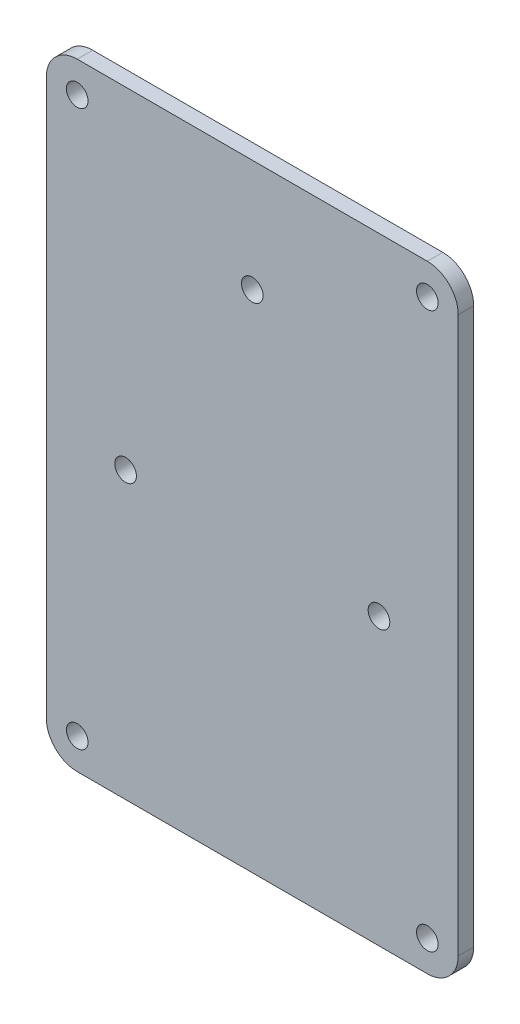
ISO-10303-21;
HEADER;
FILE_DESCRIPTION(('STEP AP214'),'2;1');
FILE_NAME('part.step','',(''),(''),'','','');
FILE_SCHEMA(('AUTOMOTIVE_DESIGN { 1 0 10303 214 1 1 1 1 }'));
ENDSEC;
DATA;
#1=APPLICATION_CONTEXT('core data for automotive mechanical design processes');
#2=APPLICATION_PROTOCOL_DEFINITION('international standard','automotive_design',2000,#1);
#3=PRODUCT_CONTEXT('',#1,'mechanical');
#4=PRODUCT('Part','Part','',(#3));
#5=PRODUCT_RELATED_PRODUCT_CATEGORY('part','',(#4));
#6=PRODUCT_DEFINITION_FORMATION('','',#4);
#7=PRODUCT_DEFINITION_CONTEXT('part definition',#1,'design');
#8=PRODUCT_DEFINITION('design','',#6,#7);
#9=PRODUCT_DEFINITION_SHAPE('','',#8);
#10=(LENGTH_UNIT() NAMED_UNIT(*) SI_UNIT(.MILLI.,.METRE.));
#11=(NAMED_UNIT(*) PLANE_ANGLE_UNIT() SI_UNIT($,.RADIAN.));
#12=(NAMED_UNIT(*) SI_UNIT($,.STERADIAN.) SOLID_ANGLE_UNIT());
#13=UNCERTAINTY_MEASURE_WITH_UNIT(LENGTH_MEASURE(1.E-05),#10,'distance_accuracy_value','');
#14=(GEOMETRIC_REPRESENTATION_CONTEXT(3) GLOBAL_UNCERTAINTY_ASSIGNED_CONTEXT((#13)) GLOBAL_UNIT_ASSIGNED_CONTEXT((#10,
#11,#12)) REPRESENTATION_CONTEXT('',''));
#15=CARTESIAN_POINT('',(0.,0.,0.));
#16=DIRECTION('',(0.,0.,1.));
#17=DIRECTION('',(1.,0.,0.));
#18=AXIS2_PLACEMENT_3D('',#15,#16,#17);
#19=CARTESIAN_POINT('',(16.0396429889786,-38.5045909389636,3.));
#20=DIRECTION('',(0.,0.,1.));
#21=DIRECTION('',(1.,0.,0.));
#22=AXIS2_PLACEMENT_3D('',#19,#20,#21);
#23=PLANE('',#22);
#24=CARTESIAN_POINT('',(-17.9603570110214,53.5785724250069,3.));
#25=DIRECTION('',(0.,0.,1.));
#26=DIRECTION('',(1.,0.,0.));
#27=AXIS2_PLACEMENT_3D('',#24,#25,#26);
#28=CIRCLE('',#27,2.09999999999999);
#29=CARTESIAN_POINT('',(-15.8603570110214,53.5785724250069,3.));
#30=VERTEX_POINT('',#29);
#31=EDGE_CURVE('E200',#30,#30,#28,.T.);
#32=ORIENTED_EDGE('',*,*,#31,.F.);
#33=EDGE_LOOP('',(#32));
#34=FACE_BOUND('',#33,.T.);
#35=CARTESIAN_POINT('',(-42.5680521656082,10.9567941600962,3.));
#36=DIRECTION('',(0.,0.,1.));
#37=DIRECTION('',(1.,0.,0.));
#38=AXIS2_PLACEMENT_3D('',#35,#36,#37);
#39=CIRCLE('',#38,2.09999999999999);
#40=CARTESIAN_POINT('',(-40.4680521656082,10.9567941600962,3.));
#41=VERTEX_POINT('',#40);
#42=EDGE_CURVE('E205',#41,#41,#39,.T.);
#43=ORIENTED_EDGE('',*,*,#42,.F.);
#44=EDGE_LOOP('',(#43));
#45=FACE_BOUND('',#44,.T.);
#46=CARTESIAN_POINT('',(6.64733814356531,10.9567941600962,3.));
#47=DIRECTION('',(0.,0.,1.));
#48=DIRECTION('',(1.,0.,0.));
#49=AXIS2_PLACEMENT_3D('',#46,#47,#48);
#50=CIRCLE('',#49,2.09999999999999);
#51=CARTESIAN_POINT('',(8.7473381435653,10.9567941600962,3.));
#52=VERTEX_POINT('',#51);
#53=EDGE_CURVE('E208',#52,#52,#50,.T.);
#54=ORIENTED_EDGE('',*,*,#53,.F.);
#55=EDGE_LOOP('',(#54));
#56=FACE_BOUND('',#55,.T.);
#57=CARTESIAN_POINT('',(16.0396429889786,69.3474480818207,3.));
#58=DIRECTION('',(0.,0.,1.));
#59=DIRECTION('',(1.,0.,0.));
#60=AXIS2_PLACEMENT_3D('',#57,#58,#59);
#61=CIRCLE('',#60,2.1);
#62=CARTESIAN_POINT('',(18.1396429889786,69.3474480818207,3.));
#63=VERTEX_POINT('',#62);
#64=EDGE_CURVE('E188',#63,#63,#61,.T.);
#65=ORIENTED_EDGE('',*,*,#64,.F.);
#66=EDGE_LOOP('',(#65));
#67=FACE_BOUND('',#66,.T.);
#68=CARTESIAN_POINT('',(-51.9603570110214,-38.5045909389636,3.));
#69=DIRECTION('',(0.,0.,1.));
#70=DIRECTION('',(1.,0.,0.));
#71=AXIS2_PLACEMENT_3D('',#68,#69,#70);
#72=CIRCLE('',#71,2.1);
#73=CARTESIAN_POINT('',(-49.8603570110214,-38.5045909389636,3.));
#74=VERTEX_POINT('',#73);
#75=EDGE_CURVE('E134',#74,#74,#72,.T.);
#76=ORIENTED_EDGE('',*,*,#75,.F.);
#77=EDGE_LOOP('',(#76));
#78=FACE_BOUND('',#77,.T.);
#79=CARTESIAN_POINT('',(16.0396429889786,-38.5045909389636,3.));
#80=DIRECTION('',(0.,0.,1.));
#81=DIRECTION('',(1.,0.,0.));
#82=AXIS2_PLACEMENT_3D('',#79,#80,#81);
#83=CIRCLE('',#82,6.);
#84=CARTESIAN_POINT('',(16.0396429889785,-44.5045909389636,3.));
#85=VERTEX_POINT('',#84);
#86=CARTESIAN_POINT('',(22.0396429889786,-38.5045909389636,3.));
#87=VERTEX_POINT('',#86);
#88=EDGE_CURVE('E145',#85,#87,#83,.T.);
#89=ORIENTED_EDGE('',*,*,#88,.T.);
#90=DIRECTION('',(0.,1.,0.));
#91=VECTOR('',#90,1.);
#92=CARTESIAN_POINT('',(22.0396429889786,-38.5045909389636,3.));
#93=LINE('',#92,#91);
#94=CARTESIAN_POINT('',(22.0396429889786,69.3474480818207,3.));
#95=VERTEX_POINT('',#94);
#96=EDGE_CURVE('E93',#87,#95,#93,.T.);
#97=ORIENTED_EDGE('',*,*,#96,.T.);
#98=CARTESIAN_POINT('',(16.0396429889786,69.3474480818207,3.));
#99=DIRECTION('',(0.,0.,1.));
#100=DIRECTION('',(1.,0.,0.));
#101=AXIS2_PLACEMENT_3D('',#98,#99,#100);
#102=CIRCLE('',#101,5.99999999999999);
#103=CARTESIAN_POINT('',(16.0396429889786,75.3474480818207,3.));
#104=VERTEX_POINT('',#103);
#105=EDGE_CURVE('E160',#95,#104,#102,.T.);
#106=ORIENTED_EDGE('',*,*,#105,.T.);
#107=DIRECTION('',(-1.,0.,0.));
#108=VECTOR('',#107,1.);
#109=CARTESIAN_POINT('',(16.0396429889786,75.3474480818207,3.));
#110=LINE('',#109,#108);
#111=CARTESIAN_POINT('',(-51.9603570110214,75.3474480818207,3.));
#112=VERTEX_POINT('',#111);
#113=EDGE_CURVE('E173',#104,#112,#110,.T.);
#114=ORIENTED_EDGE('',*,*,#113,.T.);
#115=CARTESIAN_POINT('',(-51.9603570110214,69.3474480818207,3.));
#116=DIRECTION('',(0.,0.,1.));
#117=DIRECTION('',(1.,0.,0.));
#118=AXIS2_PLACEMENT_3D('',#115,#116,#117);
#119=CIRCLE('',#118,5.99999999999999);
#120=CARTESIAN_POINT('',(-57.9603570110214,69.3474480818207,3.));
#121=VERTEX_POINT('',#120);
#122=EDGE_CURVE('E112',#112,#121,#119,.T.);
#123=ORIENTED_EDGE('',*,*,#122,.T.);
#124=DIRECTION('',(0.,-1.,0.));
#125=VECTOR('',#124,1.);
#126=CARTESIAN_POINT('',(-57.9603570110214,69.3474480818207,3.));
#127=LINE('',#126,#125);
#128=CARTESIAN_POINT('',(-57.9603570110214,-38.5045909389636,3.));
#129=VERTEX_POINT('',#128);
#130=EDGE_CURVE('E106',#121,#129,#127,.T.);
#131=ORIENTED_EDGE('',*,*,#130,.T.);
#132=CARTESIAN_POINT('',(-51.9603570110214,-38.5045909389636,3.));
#133=DIRECTION('',(0.,0.,1.));
#134=DIRECTION('',(1.,0.,0.));
#135=AXIS2_PLACEMENT_3D('',#132,#133,#134);
#136=CIRCLE('',#135,6.);
#137=CARTESIAN_POINT('',(-51.9603570110214,-44.5045909389636,3.));
#138=VERTEX_POINT('',#137);
#139=EDGE_CURVE('E110',#129,#138,#136,.T.);
#140=ORIENTED_EDGE('',*,*,#139,.T.);
#141=DIRECTION('',(1.,0.,0.));
#142=VECTOR('',#141,1.);
#143=CARTESIAN_POINT('',(-51.9603570110214,-44.5045909389636,3.));
#144=LINE('',#143,#142);
#145=EDGE_CURVE('E50',#138,#85,#144,.T.);
#146=ORIENTED_EDGE('',*,*,#145,.T.);
#147=EDGE_LOOP('',(#89,#97,#106,#114,#123,#131,#140,#146));
#148=FACE_BOUND('',#147,.T.);
#149=CARTESIAN_POINT('',(16.0396429889786,-38.5045909389636,3.));
#150=DIRECTION('',(0.,0.,1.));
#151=DIRECTION('',(1.,0.,0.));
#152=AXIS2_PLACEMENT_3D('',#149,#150,#151);
#153=CIRCLE('',#152,2.1);
#154=CARTESIAN_POINT('',(18.1396429889786,-38.5045909389636,3.));
#155=VERTEX_POINT('',#154);
#156=EDGE_CURVE('E182',#155,#155,#153,.T.);
#157=ORIENTED_EDGE('',*,*,#156,.F.);
#158=EDGE_LOOP('',(#157));
#159=FACE_BOUND('',#158,.T.);
#160=CARTESIAN_POINT('',(-51.9603570110214,69.3474480818207,3.));
#161=DIRECTION('',(0.,0.,1.));
#162=DIRECTION('',(1.,0.,0.));
#163=AXIS2_PLACEMENT_3D('',#160,#161,#162);
#164=CIRCLE('',#163,2.09999999999999);
#165=CARTESIAN_POINT('',(-49.8603570110214,69.3474480818207,3.));
#166=VERTEX_POINT('',#165);
#167=EDGE_CURVE('E194',#166,#166,#164,.T.);
#168=ORIENTED_EDGE('',*,*,#167,.F.);
#169=EDGE_LOOP('',(#168));
#170=FACE_BOUND('',#169,.T.);
#171=ADVANCED_FACE('F33',(#34,#45,#56,#67,#78,#148,#159,#170),#23,.T.);
#172=CARTESIAN_POINT('',(16.0396429889786,-38.5045909389636,0.));
#173=DIRECTION('',(0.,0.,1.));
#174=DIRECTION('',(1.,0.,0.));
#175=AXIS2_PLACEMENT_3D('',#172,#173,#174);
#176=PLANE('',#175);
#177=CARTESIAN_POINT('',(-17.9603570110214,53.5785724250069,0.));
#178=DIRECTION('',(0.,0.,-1.));
#179=DIRECTION('',(-1.,0.,0.));
#180=AXIS2_PLACEMENT_3D('',#177,#178,#179);
#181=CIRCLE('',#180,2.09999999999999);
#182=CARTESIAN_POINT('',(-20.0603570110214,53.5785724250069,0.));
#183=VERTEX_POINT('',#182);
#184=EDGE_CURVE('E211',#183,#183,#181,.T.);
#185=ORIENTED_EDGE('',*,*,#184,.F.);
#186=EDGE_LOOP('',(#185));
#187=FACE_BOUND('',#186,.T.);
#188=CARTESIAN_POINT('',(-42.5680521656082,10.9567941600962,0.));
#189=DIRECTION('',(0.,0.,-1.));
#190=DIRECTION('',(-1.,0.,0.));
#191=AXIS2_PLACEMENT_3D('',#188,#189,#190);
#192=CIRCLE('',#191,2.09999999999999);
#193=CARTESIAN_POINT('',(-44.6680521656082,10.9567941600962,0.));
#194=VERTEX_POINT('',#193);
#195=EDGE_CURVE('E215',#194,#194,#192,.T.);
#196=ORIENTED_EDGE('',*,*,#195,.F.);
#197=EDGE_LOOP('',(#196));
#198=FACE_BOUND('',#197,.T.);
#199=CARTESIAN_POINT('',(6.64733814356531,10.9567941600962,0.));
#200=DIRECTION('',(0.,0.,-1.));
#201=DIRECTION('',(-1.,0.,0.));
#202=AXIS2_PLACEMENT_3D('',#199,#200,#201);
#203=CIRCLE('',#202,2.09999999999999);
#204=CARTESIAN_POINT('',(4.54733814356532,10.9567941600962,0.));
#205=VERTEX_POINT('',#204);
#206=EDGE_CURVE('E212',#205,#205,#203,.T.);
#207=ORIENTED_EDGE('',*,*,#206,.F.);
#208=EDGE_LOOP('',(#207));
#209=FACE_BOUND('',#208,.T.);
#210=CARTESIAN_POINT('',(16.0396429889786,-38.5045909389636,0.));
#211=DIRECTION('',(0.,0.,1.));
#212=DIRECTION('',(1.,0.,0.));
#213=AXIS2_PLACEMENT_3D('',#210,#211,#212);
#214=CIRCLE('',#213,6.);
#215=CARTESIAN_POINT('',(16.0396429889785,-44.5045909389636,0.));
#216=VERTEX_POINT('',#215);
#217=CARTESIAN_POINT('',(22.0396429889786,-38.5045909389636,0.));
#218=VERTEX_POINT('',#217);
#219=EDGE_CURVE('E130',#216,#218,#214,.T.);
#220=ORIENTED_EDGE('',*,*,#219,.F.);
#221=DIRECTION('',(1.,0.,0.));
#222=VECTOR('',#221,1.);
#223=CARTESIAN_POINT('',(-51.9603570110214,-44.5045909389636,0.));
#224=LINE('',#223,#222);
#225=CARTESIAN_POINT('',(-51.9603570110214,-44.5045909389636,0.));
#226=VERTEX_POINT('',#225);
#227=EDGE_CURVE('E85',#226,#216,#224,.T.);
#228=ORIENTED_EDGE('',*,*,#227,.F.);
#229=CARTESIAN_POINT('',(-51.9603570110214,-38.5045909389636,0.));
#230=DIRECTION('',(0.,0.,1.));
#231=DIRECTION('',(1.,0.,0.));
#232=AXIS2_PLACEMENT_3D('',#229,#230,#231);
#233=CIRCLE('',#232,6.);
#234=CARTESIAN_POINT('',(-57.9603570110214,-38.5045909389636,0.));
#235=VERTEX_POINT('',#234);
#236=EDGE_CURVE('E79',#235,#226,#233,.T.);
#237=ORIENTED_EDGE('',*,*,#236,.F.);
#238=DIRECTION('',(0.,-1.,0.));
#239=VECTOR('',#238,1.);
#240=CARTESIAN_POINT('',(-57.9603570110214,69.3474480818207,0.));
#241=LINE('',#240,#239);
#242=CARTESIAN_POINT('',(-57.9603570110214,69.3474480818207,0.));
#243=VERTEX_POINT('',#242);
#244=EDGE_CURVE('E120',#243,#235,#241,.T.);
#245=ORIENTED_EDGE('',*,*,#244,.F.);
#246=CARTESIAN_POINT('',(-51.9603570110214,69.3474480818207,0.));
#247=DIRECTION('',(0.,0.,1.));
#248=DIRECTION('',(1.,0.,0.));
#249=AXIS2_PLACEMENT_3D('',#246,#247,#248);
#250=CIRCLE('',#249,5.99999999999999);
#251=CARTESIAN_POINT('',(-51.9603570110214,75.3474480818207,0.));
#252=VERTEX_POINT('',#251);
#253=EDGE_CURVE('E140',#252,#243,#250,.T.);
#254=ORIENTED_EDGE('',*,*,#253,.F.);
#255=DIRECTION('',(-1.,0.,0.));
#256=VECTOR('',#255,1.);
#257=CARTESIAN_POINT('',(16.0396429889786,75.3474480818207,0.));
#258=LINE('',#257,#256);
#259=CARTESIAN_POINT('',(16.0396429889786,75.3474480818207,0.));
#260=VERTEX_POINT('',#259);
#261=EDGE_CURVE('E138',#260,#252,#258,.T.);
#262=ORIENTED_EDGE('',*,*,#261,.F.);
#263=CARTESIAN_POINT('',(16.0396429889786,69.3474480818207,0.));
#264=DIRECTION('',(0.,0.,1.));
#265=DIRECTION('',(1.,0.,0.));
#266=AXIS2_PLACEMENT_3D('',#263,#264,#265);
#267=CIRCLE('',#266,5.99999999999999);
#268=CARTESIAN_POINT('',(22.0396429889786,69.3474480818207,0.));
#269=VERTEX_POINT('',#268);
#270=EDGE_CURVE('E136',#269,#260,#267,.T.);
#271=ORIENTED_EDGE('',*,*,#270,.F.);
#272=DIRECTION('',(0.,1.,0.));
#273=VECTOR('',#272,1.);
#274=CARTESIAN_POINT('',(22.0396429889786,-38.5045909389636,0.));
#275=LINE('',#274,#273);
#276=EDGE_CURVE('E133',#218,#269,#275,.T.);
#277=ORIENTED_EDGE('',*,*,#276,.F.);
#278=EDGE_LOOP('',(#220,#228,#237,#245,#254,#262,#271,#277));
#279=FACE_BOUND('',#278,.T.);
#280=CARTESIAN_POINT('',(-51.9603570110214,-38.5045909389636,0.));
#281=DIRECTION('',(0.,0.,1.));
#282=DIRECTION('',(1.,0.,0.));
#283=AXIS2_PLACEMENT_3D('',#280,#281,#282);
#284=CIRCLE('',#283,2.1);
#285=CARTESIAN_POINT('',(-49.8603570110214,-38.5045909389636,0.));
#286=VERTEX_POINT('',#285);
#287=EDGE_CURVE('E179',#286,#286,#284,.T.);
#288=ORIENTED_EDGE('',*,*,#287,.T.);
#289=EDGE_LOOP('',(#288));
#290=FACE_BOUND('',#289,.T.);
#291=CARTESIAN_POINT('',(16.0396429889786,-38.5045909389636,0.));
#292=DIRECTION('',(0.,0.,1.));
#293=DIRECTION('',(1.,0.,0.));
#294=AXIS2_PLACEMENT_3D('',#291,#292,#293);
#295=CIRCLE('',#294,2.1);
#296=CARTESIAN_POINT('',(18.1396429889786,-38.5045909389636,0.));
#297=VERTEX_POINT('',#296);
#298=EDGE_CURVE('E185',#297,#297,#295,.T.);
#299=ORIENTED_EDGE('',*,*,#298,.T.);
#300=EDGE_LOOP('',(#299));
#301=FACE_BOUND('',#300,.T.);
#302=CARTESIAN_POINT('',(16.0396429889786,69.3474480818207,0.));
#303=DIRECTION('',(0.,0.,1.));
#304=DIRECTION('',(1.,0.,0.));
#305=AXIS2_PLACEMENT_3D('',#302,#303,#304);
#306=CIRCLE('',#305,2.1);
#307=CARTESIAN_POINT('',(18.1396429889786,69.3474480818207,0.));
#308=VERTEX_POINT('',#307);
#309=EDGE_CURVE('E191',#308,#308,#306,.T.);
#310=ORIENTED_EDGE('',*,*,#309,.T.);
#311=EDGE_LOOP('',(#310));
#312=FACE_BOUND('',#311,.T.);
#313=CARTESIAN_POINT('',(-51.9603570110214,69.3474480818207,0.));
#314=DIRECTION('',(0.,0.,1.));
#315=DIRECTION('',(1.,0.,0.));
#316=AXIS2_PLACEMENT_3D('',#313,#314,#315);
#317=CIRCLE('',#316,2.09999999999999);
#318=CARTESIAN_POINT('',(-49.8603570110214,69.3474480818207,0.));
#319=VERTEX_POINT('',#318);
#320=EDGE_CURVE('E197',#319,#319,#317,.T.);
#321=ORIENTED_EDGE('',*,*,#320,.T.);
#322=EDGE_LOOP('',(#321));
#323=FACE_BOUND('',#322,.T.);
#324=ADVANCED_FACE('F164',(#187,#198,#209,#279,#290,#301,#312,#323),#176,.F.);
#325=CARTESIAN_POINT('',(16.0396429889786,-38.5045909389636,3.));
#326=DIRECTION('',(0.,0.,-1.));
#327=DIRECTION('',(-1.,0.,0.));
#328=AXIS2_PLACEMENT_3D('',#325,#326,#327);
#329=CYLINDRICAL_SURFACE('',#328,6.);
#330=ORIENTED_EDGE('',*,*,#219,.T.);
#331=DIRECTION('',(0.,0.,-1.));
#332=VECTOR('',#331,1.);
#333=CARTESIAN_POINT('',(22.0396429889786,-38.5045909389636,3.));
#334=LINE('',#333,#332);
#335=EDGE_CURVE('E11',#87,#218,#334,.T.);
#336=ORIENTED_EDGE('',*,*,#335,.F.);
#337=ORIENTED_EDGE('',*,*,#88,.F.);
#338=DIRECTION('',(0.,0.,-1.));
#339=VECTOR('',#338,1.);
#340=CARTESIAN_POINT('',(16.0396429889785,-44.5045909389636,3.));
#341=LINE('',#340,#339);
#342=EDGE_CURVE('E126',#85,#216,#341,.T.);
#343=ORIENTED_EDGE('',*,*,#342,.T.);
#344=EDGE_LOOP('',(#330,#336,#337,#343));
#345=FACE_BOUND('',#344,.T.);
#346=ADVANCED_FACE('F35',(#345),#329,.T.);
#347=CARTESIAN_POINT('',(22.0396429889786,-38.5045909389636,3.));
#348=DIRECTION('',(-1.,0.,0.));
#349=DIRECTION('',(0.,-1.,0.));
#350=AXIS2_PLACEMENT_3D('',#347,#348,#349);
#351=PLANE('',#350);
#352=ORIENTED_EDGE('',*,*,#276,.T.);
#353=DIRECTION('',(0.,0.,-1.));
#354=VECTOR('',#353,1.);
#355=CARTESIAN_POINT('',(22.0396429889786,69.3474480818207,3.));
#356=LINE('',#355,#354);
#357=EDGE_CURVE('E42',#95,#269,#356,.T.);
#358=ORIENTED_EDGE('',*,*,#357,.F.);
#359=ORIENTED_EDGE('',*,*,#96,.F.);
#360=ORIENTED_EDGE('',*,*,#335,.T.);
#361=EDGE_LOOP('',(#352,#358,#359,#360));
#362=FACE_BOUND('',#361,.T.);
#363=ADVANCED_FACE('F269',(#362),#351,.F.);
#364=CARTESIAN_POINT('',(16.0396429889786,69.3474480818207,3.));
#365=DIRECTION('',(0.,0.,-1.));
#366=DIRECTION('',(-1.,0.,0.));
#367=AXIS2_PLACEMENT_3D('',#364,#365,#366);
#368=CYLINDRICAL_SURFACE('',#367,5.99999999999999);
#369=ORIENTED_EDGE('',*,*,#270,.T.);
#370=DIRECTION('',(0.,0.,-1.));
#371=VECTOR('',#370,1.);
#372=CARTESIAN_POINT('',(16.0396429889786,75.3474480818207,3.));
#373=LINE('',#372,#371);
#374=EDGE_CURVE('E152',#104,#260,#373,.T.);
#375=ORIENTED_EDGE('',*,*,#374,.F.);
#376=ORIENTED_EDGE('',*,*,#105,.F.);
#377=ORIENTED_EDGE('',*,*,#357,.T.);
#378=EDGE_LOOP('',(#369,#375,#376,#377));
#379=FACE_BOUND('',#378,.T.);
#380=ADVANCED_FACE('F158',(#379),#368,.T.);
#381=CARTESIAN_POINT('',(16.0396429889786,75.3474480818207,3.));
#382=DIRECTION('',(0.,-1.,0.));
#383=DIRECTION('',(0.,0.,-1.));
#384=AXIS2_PLACEMENT_3D('',#381,#382,#383);
#385=PLANE('',#384);
#386=ORIENTED_EDGE('',*,*,#261,.T.);
#387=DIRECTION('',(0.,0.,-1.));
#388=VECTOR('',#387,1.);
#389=CARTESIAN_POINT('',(-51.9603570110214,75.3474480818207,3.));
#390=LINE('',#389,#388);
#391=EDGE_CURVE('E149',#112,#252,#390,.T.);
#392=ORIENTED_EDGE('',*,*,#391,.F.);
#393=ORIENTED_EDGE('',*,*,#113,.F.);
#394=ORIENTED_EDGE('',*,*,#374,.T.);
#395=EDGE_LOOP('',(#386,#392,#393,#394));
#396=FACE_BOUND('',#395,.T.);
#397=ADVANCED_FACE('F169',(#396),#385,.F.);
#398=CARTESIAN_POINT('',(-51.9603570110214,69.3474480818207,3.));
#399=DIRECTION('',(0.,0.,-1.));
#400=DIRECTION('',(-1.,0.,0.));
#401=AXIS2_PLACEMENT_3D('',#398,#399,#400);
#402=CYLINDRICAL_SURFACE('',#401,5.99999999999999);
#403=ORIENTED_EDGE('',*,*,#253,.T.);
#404=DIRECTION('',(0.,0.,-1.));
#405=VECTOR('',#404,1.);
#406=CARTESIAN_POINT('',(-57.9603570110214,69.3474480818207,3.));
#407=LINE('',#406,#405);
#408=EDGE_CURVE('E121',#121,#243,#407,.T.);
#409=ORIENTED_EDGE('',*,*,#408,.F.);
#410=ORIENTED_EDGE('',*,*,#122,.F.);
#411=ORIENTED_EDGE('',*,*,#391,.T.);
#412=EDGE_LOOP('',(#403,#409,#410,#411));
#413=FACE_BOUND('',#412,.T.);
#414=ADVANCED_FACE('F172',(#413),#402,.T.);
#415=CARTESIAN_POINT('',(-57.9603570110214,69.3474480818207,3.));
#416=DIRECTION('',(1.,0.,0.));
#417=DIRECTION('',(0.,1.,0.));
#418=AXIS2_PLACEMENT_3D('',#415,#416,#417);
#419=PLANE('',#418);
#420=ORIENTED_EDGE('',*,*,#244,.T.);
#421=DIRECTION('',(0.,0.,-1.));
#422=VECTOR('',#421,1.);
#423=CARTESIAN_POINT('',(-57.9603570110214,-38.5045909389636,3.));
#424=LINE('',#423,#422);
#425=EDGE_CURVE('E117',#129,#235,#424,.T.);
#426=ORIENTED_EDGE('',*,*,#425,.F.);
#427=ORIENTED_EDGE('',*,*,#130,.F.);
#428=ORIENTED_EDGE('',*,*,#408,.T.);
#429=EDGE_LOOP('',(#420,#426,#427,#428));
#430=FACE_BOUND('',#429,.T.);
#431=ADVANCED_FACE('F118',(#430),#419,.F.);
#432=CARTESIAN_POINT('',(-51.9603570110214,-38.5045909389636,3.));
#433=DIRECTION('',(0.,0.,-1.));
#434=DIRECTION('',(-1.,0.,0.));
#435=AXIS2_PLACEMENT_3D('',#432,#433,#434);
#436=CYLINDRICAL_SURFACE('',#435,6.);
#437=ORIENTED_EDGE('',*,*,#236,.T.);
#438=DIRECTION('',(0.,0.,-1.));
#439=VECTOR('',#438,1.);
#440=CARTESIAN_POINT('',(-51.9603570110214,-44.5045909389636,3.));
#441=LINE('',#440,#439);
#442=EDGE_CURVE('E122',#138,#226,#441,.T.);
#443=ORIENTED_EDGE('',*,*,#442,.F.);
#444=ORIENTED_EDGE('',*,*,#139,.F.);
#445=ORIENTED_EDGE('',*,*,#425,.T.);
#446=EDGE_LOOP('',(#437,#443,#444,#445));
#447=FACE_BOUND('',#446,.T.);
#448=ADVANCED_FACE('F124',(#447),#436,.T.);
#449=CARTESIAN_POINT('',(-51.9603570110214,-44.5045909389636,3.));
#450=DIRECTION('',(0.,1.,0.));
#451=DIRECTION('',(0.,0.,1.));
#452=AXIS2_PLACEMENT_3D('',#449,#450,#451);
#453=PLANE('',#452);
#454=ORIENTED_EDGE('',*,*,#227,.T.);
#455=ORIENTED_EDGE('',*,*,#342,.F.);
#456=ORIENTED_EDGE('',*,*,#145,.F.);
#457=ORIENTED_EDGE('',*,*,#442,.T.);
#458=EDGE_LOOP('',(#454,#455,#456,#457));
#459=FACE_BOUND('',#458,.T.);
#460=ADVANCED_FACE('F257',(#459),#453,.F.);
#461=CARTESIAN_POINT('',(-51.9603570110214,-38.5045909389636,3.));
#462=DIRECTION('',(0.,0.,-1.));
#463=DIRECTION('',(-1.,0.,0.));
#464=AXIS2_PLACEMENT_3D('',#461,#462,#463);
#465=CYLINDRICAL_SURFACE('',#464,2.1);
#466=ORIENTED_EDGE('',*,*,#75,.T.);
#467=EDGE_LOOP('',(#466));
#468=FACE_BOUND('',#467,.T.);
#469=ORIENTED_EDGE('',*,*,#287,.F.);
#470=EDGE_LOOP('',(#469));
#471=FACE_BOUND('',#470,.T.);
#472=ADVANCED_FACE('F254',(#468,#471),#465,.F.);
#473=CARTESIAN_POINT('',(16.0396429889786,-38.5045909389636,3.));
#474=DIRECTION('',(0.,0.,-1.));
#475=DIRECTION('',(-1.,0.,0.));
#476=AXIS2_PLACEMENT_3D('',#473,#474,#475);
#477=CYLINDRICAL_SURFACE('',#476,2.1);
#478=ORIENTED_EDGE('',*,*,#156,.T.);
#479=EDGE_LOOP('',(#478));
#480=FACE_BOUND('',#479,.T.);
#481=ORIENTED_EDGE('',*,*,#298,.F.);
#482=EDGE_LOOP('',(#481));
#483=FACE_BOUND('',#482,.T.);
#484=ADVANCED_FACE('F320',(#480,#483),#477,.F.);
#485=CARTESIAN_POINT('',(16.0396429889786,69.3474480818207,3.));
#486=DIRECTION('',(0.,0.,-1.));
#487=DIRECTION('',(-1.,0.,0.));
#488=AXIS2_PLACEMENT_3D('',#485,#486,#487);
#489=CYLINDRICAL_SURFACE('',#488,2.1);
#490=ORIENTED_EDGE('',*,*,#64,.T.);
#491=EDGE_LOOP('',(#490));
#492=FACE_BOUND('',#491,.T.);
#493=ORIENTED_EDGE('',*,*,#309,.F.);
#494=EDGE_LOOP('',(#493));
#495=FACE_BOUND('',#494,.T.);
#496=ADVANCED_FACE('F242',(#492,#495),#489,.F.);
#497=CARTESIAN_POINT('',(-51.9603570110214,69.3474480818207,3.));
#498=DIRECTION('',(0.,0.,-1.));
#499=DIRECTION('',(-1.,0.,0.));
#500=AXIS2_PLACEMENT_3D('',#497,#498,#499);
#501=CYLINDRICAL_SURFACE('',#500,2.09999999999999);
#502=ORIENTED_EDGE('',*,*,#167,.T.);
#503=EDGE_LOOP('',(#502));
#504=FACE_BOUND('',#503,.T.);
#505=ORIENTED_EDGE('',*,*,#320,.F.);
#506=EDGE_LOOP('',(#505));
#507=FACE_BOUND('',#506,.T.);
#508=ADVANCED_FACE('F233',(#504,#507),#501,.F.);
#509=CARTESIAN_POINT('',(6.64733814356531,10.9567941600962,10.));
#510=DIRECTION('',(0.,0.,-1.));
#511=DIRECTION('',(-1.,0.,0.));
#512=AXIS2_PLACEMENT_3D('',#509,#510,#511);
#513=CYLINDRICAL_SURFACE('',#512,2.09999999999999);
#514=ORIENTED_EDGE('',*,*,#53,.T.);
#515=EDGE_LOOP('',(#514));
#516=FACE_BOUND('',#515,.T.);
#517=ORIENTED_EDGE('',*,*,#206,.T.);
#518=EDGE_LOOP('',(#517));
#519=FACE_BOUND('',#518,.T.);
#520=ADVANCED_FACE('F230',(#516,#519),#513,.F.);
#521=CARTESIAN_POINT('',(-42.5680521656082,10.9567941600962,10.));
#522=DIRECTION('',(0.,0.,-1.));
#523=DIRECTION('',(-1.,0.,0.));
#524=AXIS2_PLACEMENT_3D('',#521,#522,#523);
#525=CYLINDRICAL_SURFACE('',#524,2.09999999999999);
#526=ORIENTED_EDGE('',*,*,#42,.T.);
#527=EDGE_LOOP('',(#526));
#528=FACE_BOUND('',#527,.T.);
#529=ORIENTED_EDGE('',*,*,#195,.T.);
#530=EDGE_LOOP('',(#529));
#531=FACE_BOUND('',#530,.T.);
#532=ADVANCED_FACE('F232',(#528,#531),#525,.F.);
#533=CARTESIAN_POINT('',(-17.9603570110214,53.5785724250069,10.));
#534=DIRECTION('',(0.,0.,-1.));
#535=DIRECTION('',(-1.,0.,0.));
#536=AXIS2_PLACEMENT_3D('',#533,#534,#535);
#537=CYLINDRICAL_SURFACE('',#536,2.09999999999999);
#538=ORIENTED_EDGE('',*,*,#31,.T.);
#539=EDGE_LOOP('',(#538));
#540=FACE_BOUND('',#539,.T.);
#541=ORIENTED_EDGE('',*,*,#184,.T.);
#542=EDGE_LOOP('',(#541));
#543=FACE_BOUND('',#542,.T.);
#544=ADVANCED_FACE('F221',(#540,#543),#537,.F.);
#545=CLOSED_SHELL('',(#171,#324,#346,#363,#380,#397,#414,#431,#448,#460,#472,#484,#496,#508,
#520,#532,#544));
#546=MANIFOLD_SOLID_BREP('B2',#545);
#547=ADVANCED_BREP_SHAPE_REPRESENTATION('',(#18,#546),#14);
#548=SHAPE_DEFINITION_REPRESENTATION(#9,#547);
ENDSEC;
END-ISO-10303-21;
